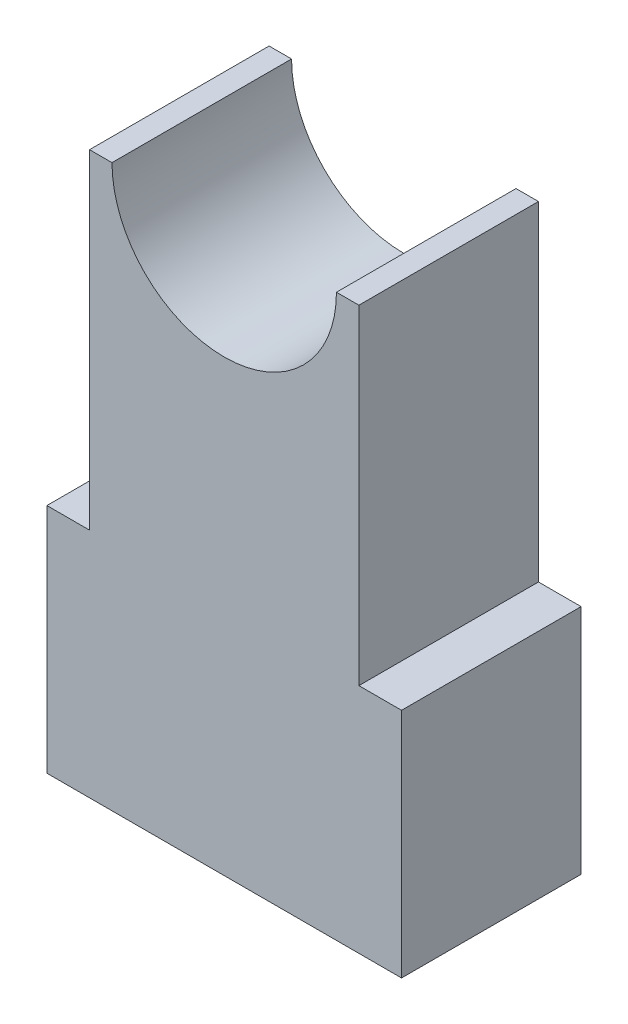
ISO-10303-21;
HEADER;
FILE_DESCRIPTION(('STEP AP214'),'2;1');
FILE_NAME('part.step','',(''),(''),'','','');
FILE_SCHEMA(('AUTOMOTIVE_DESIGN { 1 0 10303 214 1 1 1 1 }'));
ENDSEC;
DATA;
#1=APPLICATION_CONTEXT('core data for automotive mechanical design processes');
#2=APPLICATION_PROTOCOL_DEFINITION('international standard','automotive_design',2000,#1);
#3=PRODUCT_CONTEXT('',#1,'mechanical');
#4=PRODUCT('Part','Part','',(#3));
#5=PRODUCT_RELATED_PRODUCT_CATEGORY('part','',(#4));
#6=PRODUCT_DEFINITION_FORMATION('','',#4);
#7=PRODUCT_DEFINITION_CONTEXT('part definition',#1,'design');
#8=PRODUCT_DEFINITION('design','',#6,#7);
#9=PRODUCT_DEFINITION_SHAPE('','',#8);
#10=(LENGTH_UNIT() NAMED_UNIT(*) SI_UNIT(.MILLI.,.METRE.));
#11=(NAMED_UNIT(*) PLANE_ANGLE_UNIT() SI_UNIT($,.RADIAN.));
#12=(NAMED_UNIT(*) SI_UNIT($,.STERADIAN.) SOLID_ANGLE_UNIT());
#13=UNCERTAINTY_MEASURE_WITH_UNIT(LENGTH_MEASURE(1.E-05),#10,'distance_accuracy_value','');
#14=(GEOMETRIC_REPRESENTATION_CONTEXT(3) GLOBAL_UNCERTAINTY_ASSIGNED_CONTEXT((#13)) GLOBAL_UNIT_ASSIGNED_CONTEXT((#10,
#11,#12)) REPRESENTATION_CONTEXT('',''));
#15=CARTESIAN_POINT('',(0.,0.,0.));
#16=DIRECTION('',(0.,0.,1.));
#17=DIRECTION('',(1.,0.,0.));
#18=AXIS2_PLACEMENT_3D('',#15,#16,#17);
#19=CARTESIAN_POINT('',(15.8,25.01,0.));
#20=DIRECTION('',(0.,0.,-1.));
#21=DIRECTION('',(-1.,0.,0.));
#22=AXIS2_PLACEMENT_3D('',#19,#20,#21);
#23=PLANE('',#22);
#24=CARTESIAN_POINT('',(7.9,25.01,0.));
#25=DIRECTION('',(0.,0.,-1.));
#26=DIRECTION('',(-1.,0.,0.));
#27=AXIS2_PLACEMENT_3D('',#24,#25,#26);
#28=CIRCLE('',#27,5.);
#29=CARTESIAN_POINT('',(2.9,25.01,0.));
#30=VERTEX_POINT('',#29);
#31=CARTESIAN_POINT('',(12.9,25.01,0.));
#32=VERTEX_POINT('',#31);
#33=EDGE_CURVE('E121',#30,#32,#28,.F.);
#34=ORIENTED_EDGE('',*,*,#33,.F.);
#35=DIRECTION('',(1.,0.,0.));
#36=VECTOR('',#35,1.);
#37=CARTESIAN_POINT('',(15.8,25.01,0.));
#38=LINE('',#37,#36);
#39=CARTESIAN_POINT('',(1.9,25.01,0.));
#40=VERTEX_POINT('',#39);
#41=EDGE_CURVE('E159',#40,#30,#38,.T.);
#42=ORIENTED_EDGE('',*,*,#41,.F.);
#43=DIRECTION('',(0.,1.,0.));
#44=VECTOR('',#43,1.);
#45=CARTESIAN_POINT('',(1.9,10.33,0.));
#46=LINE('',#45,#44);
#47=CARTESIAN_POINT('',(1.9,10.33,0.));
#48=VERTEX_POINT('',#47);
#49=EDGE_CURVE('E167',#48,#40,#46,.T.);
#50=ORIENTED_EDGE('',*,*,#49,.F.);
#51=DIRECTION('',(1.,0.,0.));
#52=VECTOR('',#51,1.);
#53=CARTESIAN_POINT('',(1.9,10.33,0.));
#54=LINE('',#53,#52);
#55=CARTESIAN_POINT('',(0.,10.33,0.));
#56=VERTEX_POINT('',#55);
#57=EDGE_CURVE('E180',#56,#48,#54,.T.);
#58=ORIENTED_EDGE('',*,*,#57,.F.);
#59=DIRECTION('',(0.,-1.,0.));
#60=VECTOR('',#59,1.);
#61=CARTESIAN_POINT('',(0.,25.01,0.));
#62=LINE('',#61,#60);
#63=CARTESIAN_POINT('',(0.,0.,0.));
#64=VERTEX_POINT('',#63);
#65=EDGE_CURVE('E113',#56,#64,#62,.T.);
#66=ORIENTED_EDGE('',*,*,#65,.T.);
#67=DIRECTION('',(1.,0.,0.));
#68=VECTOR('',#67,1.);
#69=CARTESIAN_POINT('',(15.8,0.,0.));
#70=LINE('',#69,#68);
#71=CARTESIAN_POINT('',(15.8,0.,0.));
#72=VERTEX_POINT('',#71);
#73=EDGE_CURVE('E155',#64,#72,#70,.T.);
#74=ORIENTED_EDGE('',*,*,#73,.T.);
#75=DIRECTION('',(0.,-1.,0.));
#76=VECTOR('',#75,1.);
#77=CARTESIAN_POINT('',(15.8,25.01,0.));
#78=LINE('',#77,#76);
#79=CARTESIAN_POINT('',(15.8,10.33,0.));
#80=VERTEX_POINT('',#79);
#81=EDGE_CURVE('E138',#80,#72,#78,.T.);
#82=ORIENTED_EDGE('',*,*,#81,.F.);
#83=DIRECTION('',(1.,0.,0.));
#84=VECTOR('',#83,1.);
#85=CARTESIAN_POINT('',(13.9,10.33,0.));
#86=LINE('',#85,#84);
#87=CARTESIAN_POINT('',(13.9,10.33,0.));
#88=VERTEX_POINT('',#87);
#89=EDGE_CURVE('E190',#88,#80,#86,.T.);
#90=ORIENTED_EDGE('',*,*,#89,.F.);
#91=DIRECTION('',(0.,1.,0.));
#92=VECTOR('',#91,1.);
#93=CARTESIAN_POINT('',(13.9,10.33,0.));
#94=LINE('',#93,#92);
#95=CARTESIAN_POINT('',(13.9,25.01,0.));
#96=VERTEX_POINT('',#95);
#97=EDGE_CURVE('E175',#88,#96,#94,.T.);
#98=ORIENTED_EDGE('',*,*,#97,.T.);
#99=EDGE_CURVE('E148',#32,#96,#38,.T.);
#100=ORIENTED_EDGE('',*,*,#99,.F.);
#101=EDGE_LOOP('',(#34,#42,#50,#58,#66,#74,#82,#90,#98,#100));
#102=FACE_BOUND('',#101,.T.);
#103=ADVANCED_FACE('F32',(#102),#23,.F.);
#104=CARTESIAN_POINT('',(0.,25.01,-8.));
#105=DIRECTION('',(0.,0.,1.));
#106=DIRECTION('',(1.,0.,0.));
#107=AXIS2_PLACEMENT_3D('',#104,#105,#106);
#108=PLANE('',#107);
#109=CARTESIAN_POINT('',(7.9,25.01,-8.));
#110=DIRECTION('',(0.,0.,1.));
#111=DIRECTION('',(1.,0.,0.));
#112=AXIS2_PLACEMENT_3D('',#109,#110,#111);
#113=CIRCLE('',#112,5.);
#114=CARTESIAN_POINT('',(12.9,25.01,-8.));
#115=VERTEX_POINT('',#114);
#116=CARTESIAN_POINT('',(2.9,25.01,-8.));
#117=VERTEX_POINT('',#116);
#118=EDGE_CURVE('E117',#115,#117,#113,.F.);
#119=ORIENTED_EDGE('',*,*,#118,.F.);
#120=DIRECTION('',(-1.,0.,0.));
#121=VECTOR('',#120,1.);
#122=CARTESIAN_POINT('',(0.,25.01,-8.));
#123=LINE('',#122,#121);
#124=CARTESIAN_POINT('',(13.9,25.01,-8.));
#125=VERTEX_POINT('',#124);
#126=EDGE_CURVE('E106',#125,#115,#123,.T.);
#127=ORIENTED_EDGE('',*,*,#126,.F.);
#128=DIRECTION('',(0.,1.,0.));
#129=VECTOR('',#128,1.);
#130=CARTESIAN_POINT('',(13.9,10.33,-8.));
#131=LINE('',#130,#129);
#132=CARTESIAN_POINT('',(13.9,10.33,-8.));
#133=VERTEX_POINT('',#132);
#134=EDGE_CURVE('E184',#133,#125,#131,.T.);
#135=ORIENTED_EDGE('',*,*,#134,.F.);
#136=DIRECTION('',(-1.,0.,0.));
#137=VECTOR('',#136,1.);
#138=CARTESIAN_POINT('',(15.8,10.33,-8.));
#139=LINE('',#138,#137);
#140=CARTESIAN_POINT('',(15.8,10.33,-8.));
#141=VERTEX_POINT('',#140);
#142=EDGE_CURVE('E193',#141,#133,#139,.T.);
#143=ORIENTED_EDGE('',*,*,#142,.F.);
#144=DIRECTION('',(0.,-1.,0.));
#145=VECTOR('',#144,1.);
#146=CARTESIAN_POINT('',(15.8,25.01,-8.));
#147=LINE('',#146,#145);
#148=CARTESIAN_POINT('',(15.8,0.,-8.));
#149=VERTEX_POINT('',#148);
#150=EDGE_CURVE('E140',#141,#149,#147,.T.);
#151=ORIENTED_EDGE('',*,*,#150,.T.);
#152=DIRECTION('',(-1.,0.,0.));
#153=VECTOR('',#152,1.);
#154=CARTESIAN_POINT('',(0.,0.,-8.));
#155=LINE('',#154,#153);
#156=CARTESIAN_POINT('',(0.,0.,-8.));
#157=VERTEX_POINT('',#156);
#158=EDGE_CURVE('E149',#149,#157,#155,.T.);
#159=ORIENTED_EDGE('',*,*,#158,.T.);
#160=DIRECTION('',(0.,-1.,0.));
#161=VECTOR('',#160,1.);
#162=CARTESIAN_POINT('',(0.,25.01,-8.));
#163=LINE('',#162,#161);
#164=CARTESIAN_POINT('',(0.,10.33,-8.));
#165=VERTEX_POINT('',#164);
#166=EDGE_CURVE('E142',#165,#157,#163,.T.);
#167=ORIENTED_EDGE('',*,*,#166,.F.);
#168=DIRECTION('',(-1.,0.,0.));
#169=VECTOR('',#168,1.);
#170=CARTESIAN_POINT('',(0.,10.33,-8.));
#171=LINE('',#170,#169);
#172=CARTESIAN_POINT('',(1.9,10.33,-8.));
#173=VERTEX_POINT('',#172);
#174=EDGE_CURVE('E169',#173,#165,#171,.T.);
#175=ORIENTED_EDGE('',*,*,#174,.F.);
#176=DIRECTION('',(0.,1.,0.));
#177=VECTOR('',#176,1.);
#178=CARTESIAN_POINT('',(1.9,10.33,-8.));
#179=LINE('',#178,#177);
#180=CARTESIAN_POINT('',(1.9,25.01,-8.));
#181=VERTEX_POINT('',#180);
#182=EDGE_CURVE('E166',#173,#181,#179,.T.);
#183=ORIENTED_EDGE('',*,*,#182,.T.);
#184=EDGE_CURVE('E114',#117,#181,#123,.T.);
#185=ORIENTED_EDGE('',*,*,#184,.F.);
#186=EDGE_LOOP('',(#119,#127,#135,#143,#151,#159,#167,#175,#183,#185));
#187=FACE_BOUND('',#186,.T.);
#188=ADVANCED_FACE('F118',(#187),#108,.F.);
#189=CARTESIAN_POINT('',(0.,25.01,0.));
#190=DIRECTION('',(0.,-1.,0.));
#191=DIRECTION('',(0.,0.,-1.));
#192=AXIS2_PLACEMENT_3D('',#189,#190,#191);
#193=PLANE('',#192);
#194=DIRECTION('',(0.,0.,-1.));
#195=VECTOR('',#194,1.);
#196=CARTESIAN_POINT('',(2.9,25.01,38.3067410027269));
#197=LINE('',#196,#195);
#198=EDGE_CURVE('E11',#117,#30,#197,.F.);
#199=ORIENTED_EDGE('',*,*,#198,.F.);
#200=ORIENTED_EDGE('',*,*,#184,.T.);
#201=DIRECTION('',(0.,0.,-1.));
#202=VECTOR('',#201,1.);
#203=CARTESIAN_POINT('',(1.9,25.01,-8.));
#204=LINE('',#203,#202);
#205=EDGE_CURVE('E171',#40,#181,#204,.T.);
#206=ORIENTED_EDGE('',*,*,#205,.F.);
#207=ORIENTED_EDGE('',*,*,#41,.T.);
#208=EDGE_LOOP('',(#199,#200,#206,#207));
#209=FACE_BOUND('',#208,.T.);
#210=ADVANCED_FACE('F224',(#209),#193,.F.);
#211=DIRECTION('',(0.,0.,-1.));
#212=VECTOR('',#211,1.);
#213=CARTESIAN_POINT('',(12.9,25.01,38.3067410027269));
#214=LINE('',#213,#212);
#215=EDGE_CURVE('E40',#32,#115,#214,.T.);
#216=ORIENTED_EDGE('',*,*,#215,.F.);
#217=ORIENTED_EDGE('',*,*,#99,.T.);
#218=DIRECTION('',(0.,0.,1.));
#219=VECTOR('',#218,1.);
#220=CARTESIAN_POINT('',(13.9,25.01,-8.));
#221=LINE('',#220,#219);
#222=EDGE_CURVE('E110',#125,#96,#221,.T.);
#223=ORIENTED_EDGE('',*,*,#222,.F.);
#224=ORIENTED_EDGE('',*,*,#126,.T.);
#225=EDGE_LOOP('',(#216,#217,#223,#224));
#226=FACE_BOUND('',#225,.T.);
#227=ADVANCED_FACE('F108',(#226),#193,.F.);
#228=CARTESIAN_POINT('',(15.8,25.01,-8.));
#229=DIRECTION('',(-1.,0.,0.));
#230=DIRECTION('',(0.,0.,1.));
#231=AXIS2_PLACEMENT_3D('',#228,#229,#230);
#232=PLANE('',#231);
#233=DIRECTION('',(0.,0.,-1.));
#234=VECTOR('',#233,1.);
#235=CARTESIAN_POINT('',(15.8,10.33,0.));
#236=LINE('',#235,#234);
#237=EDGE_CURVE('E195',#80,#141,#236,.T.);
#238=ORIENTED_EDGE('',*,*,#237,.F.);
#239=ORIENTED_EDGE('',*,*,#81,.T.);
#240=DIRECTION('',(0.,0.,-1.));
#241=VECTOR('',#240,1.);
#242=CARTESIAN_POINT('',(15.8,0.,-8.));
#243=LINE('',#242,#241);
#244=EDGE_CURVE('E152',#72,#149,#243,.T.);
#245=ORIENTED_EDGE('',*,*,#244,.T.);
#246=ORIENTED_EDGE('',*,*,#150,.F.);
#247=EDGE_LOOP('',(#238,#239,#245,#246));
#248=FACE_BOUND('',#247,.T.);
#249=ADVANCED_FACE('F208',(#248),#232,.F.);
#250=CARTESIAN_POINT('',(0.,25.01,0.));
#251=DIRECTION('',(1.,0.,0.));
#252=DIRECTION('',(0.,0.,-1.));
#253=AXIS2_PLACEMENT_3D('',#250,#251,#252);
#254=PLANE('',#253);
#255=ORIENTED_EDGE('',*,*,#65,.F.);
#256=DIRECTION('',(0.,0.,1.));
#257=VECTOR('',#256,1.);
#258=CARTESIAN_POINT('',(0.,10.33,0.));
#259=LINE('',#258,#257);
#260=EDGE_CURVE('E174',#165,#56,#259,.T.);
#261=ORIENTED_EDGE('',*,*,#260,.F.);
#262=ORIENTED_EDGE('',*,*,#166,.T.);
#263=DIRECTION('',(0.,0.,1.));
#264=VECTOR('',#263,1.);
#265=CARTESIAN_POINT('',(0.,0.,0.));
#266=LINE('',#265,#264);
#267=EDGE_CURVE('E145',#157,#64,#266,.T.);
#268=ORIENTED_EDGE('',*,*,#267,.T.);
#269=EDGE_LOOP('',(#255,#261,#262,#268));
#270=FACE_BOUND('',#269,.T.);
#271=ADVANCED_FACE('F231',(#270),#254,.F.);
#272=CARTESIAN_POINT('',(0.,0.,0.));
#273=DIRECTION('',(0.,-1.,0.));
#274=DIRECTION('',(0.,0.,-1.));
#275=AXIS2_PLACEMENT_3D('',#272,#273,#274);
#276=PLANE('',#275);
#277=CARTESIAN_POINT('',(11.85,0.,-4.));
#278=DIRECTION('',(0.,-1.,0.));
#279=DIRECTION('',(0.,0.,-1.));
#280=AXIS2_PLACEMENT_3D('',#277,#278,#279);
#281=CIRCLE('',#280,2.4);
#282=CARTESIAN_POINT('',(11.85,0.,-6.4));
#283=VERTEX_POINT('',#282);
#284=EDGE_CURVE('E163',#283,#283,#281,.T.);
#285=ORIENTED_EDGE('',*,*,#284,.F.);
#286=EDGE_LOOP('',(#285));
#287=FACE_BOUND('',#286,.T.);
#288=CARTESIAN_POINT('',(3.95,0.,-4.));
#289=DIRECTION('',(0.,-1.,0.));
#290=DIRECTION('',(0.,0.,-1.));
#291=AXIS2_PLACEMENT_3D('',#288,#289,#290);
#292=CIRCLE('',#291,2.4);
#293=CARTESIAN_POINT('',(3.95,0.,-6.4));
#294=VERTEX_POINT('',#293);
#295=EDGE_CURVE('E157',#294,#294,#292,.T.);
#296=ORIENTED_EDGE('',*,*,#295,.F.);
#297=EDGE_LOOP('',(#296));
#298=FACE_BOUND('',#297,.T.);
#299=ORIENTED_EDGE('',*,*,#73,.F.);
#300=ORIENTED_EDGE('',*,*,#267,.F.);
#301=ORIENTED_EDGE('',*,*,#158,.F.);
#302=ORIENTED_EDGE('',*,*,#244,.F.);
#303=EDGE_LOOP('',(#299,#300,#301,#302));
#304=FACE_BOUND('',#303,.T.);
#305=ADVANCED_FACE('F215',(#287,#298,#304),#276,.T.);
#306=CARTESIAN_POINT('',(3.95,1.7,-4.));
#307=DIRECTION('',(0.,-1.,0.));
#308=DIRECTION('',(0.,0.,-1.));
#309=AXIS2_PLACEMENT_3D('',#306,#307,#308);
#310=CYLINDRICAL_SURFACE('',#309,2.4);
#311=CARTESIAN_POINT('',(3.95,1.5,-4.));
#312=DIRECTION('',(0.,-1.,0.));
#313=DIRECTION('',(0.,0.,-1.));
#314=AXIS2_PLACEMENT_3D('',#311,#312,#313);
#315=CIRCLE('',#314,2.4);
#316=CARTESIAN_POINT('',(3.95,1.5,-6.4));
#317=VERTEX_POINT('',#316);
#318=EDGE_CURVE('E125',#317,#317,#315,.F.);
#319=ORIENTED_EDGE('',*,*,#318,.T.);
#320=EDGE_LOOP('',(#319));
#321=FACE_BOUND('',#320,.T.);
#322=ORIENTED_EDGE('',*,*,#295,.T.);
#323=EDGE_LOOP('',(#322));
#324=FACE_BOUND('',#323,.T.);
#325=ADVANCED_FACE('F238',(#321,#324),#310,.F.);
#326=CARTESIAN_POINT('',(3.95,1.7,-4.));
#327=DIRECTION('',(0.,-1.,0.));
#328=DIRECTION('',(0.,0.,-1.));
#329=AXIS2_PLACEMENT_3D('',#326,#327,#328);
#330=PLANE('',#329);
#331=CARTESIAN_POINT('',(3.95,1.7,-4.));
#332=DIRECTION('',(0.,-1.,0.));
#333=DIRECTION('',(0.,0.,-1.));
#334=AXIS2_PLACEMENT_3D('',#331,#332,#333);
#335=CIRCLE('',#334,2.2);
#336=CARTESIAN_POINT('',(3.95,1.7,-6.2));
#337=VERTEX_POINT('',#336);
#338=EDGE_CURVE('E127',#337,#337,#335,.T.);
#339=ORIENTED_EDGE('',*,*,#338,.T.);
#340=EDGE_LOOP('',(#339));
#341=FACE_BOUND('',#340,.T.);
#342=ADVANCED_FACE('F270',(#341),#330,.T.);
#343=CARTESIAN_POINT('',(11.85,1.7,-4.));
#344=DIRECTION('',(0.,-1.,0.));
#345=DIRECTION('',(0.,0.,-1.));
#346=AXIS2_PLACEMENT_3D('',#343,#344,#345);
#347=CYLINDRICAL_SURFACE('',#346,2.4);
#348=CARTESIAN_POINT('',(11.85,1.5,-4.));
#349=DIRECTION('',(0.,-1.,0.));
#350=DIRECTION('',(0.,0.,-1.));
#351=AXIS2_PLACEMENT_3D('',#348,#349,#350);
#352=CIRCLE('',#351,2.4);
#353=CARTESIAN_POINT('',(11.85,1.5,-6.4));
#354=VERTEX_POINT('',#353);
#355=EDGE_CURVE('E132',#354,#354,#352,.F.);
#356=ORIENTED_EDGE('',*,*,#355,.T.);
#357=EDGE_LOOP('',(#356));
#358=FACE_BOUND('',#357,.T.);
#359=ORIENTED_EDGE('',*,*,#284,.T.);
#360=EDGE_LOOP('',(#359));
#361=FACE_BOUND('',#360,.T.);
#362=ADVANCED_FACE('F263',(#358,#361),#347,.F.);
#363=CARTESIAN_POINT('',(11.85,1.7,-4.));
#364=DIRECTION('',(0.,-1.,0.));
#365=DIRECTION('',(0.,0.,-1.));
#366=AXIS2_PLACEMENT_3D('',#363,#364,#365);
#367=PLANE('',#366);
#368=CARTESIAN_POINT('',(11.85,1.7,-4.));
#369=DIRECTION('',(0.,-1.,0.));
#370=DIRECTION('',(0.,0.,-1.));
#371=AXIS2_PLACEMENT_3D('',#368,#369,#370);
#372=CIRCLE('',#371,2.2);
#373=CARTESIAN_POINT('',(11.85,1.7,-6.2));
#374=VERTEX_POINT('',#373);
#375=EDGE_CURVE('E135',#374,#374,#372,.T.);
#376=ORIENTED_EDGE('',*,*,#375,.T.);
#377=EDGE_LOOP('',(#376));
#378=FACE_BOUND('',#377,.T.);
#379=ADVANCED_FACE('F261',(#378),#367,.T.);
#380=CARTESIAN_POINT('',(1.9,10.33,-8.));
#381=DIRECTION('',(1.,0.,0.));
#382=DIRECTION('',(0.,0.,-1.));
#383=AXIS2_PLACEMENT_3D('',#380,#381,#382);
#384=PLANE('',#383);
#385=ORIENTED_EDGE('',*,*,#205,.T.);
#386=ORIENTED_EDGE('',*,*,#182,.F.);
#387=DIRECTION('',(0.,0.,-1.));
#388=VECTOR('',#387,1.);
#389=CARTESIAN_POINT('',(1.9,10.33,-8.));
#390=LINE('',#389,#388);
#391=EDGE_CURVE('E177',#48,#173,#390,.T.);
#392=ORIENTED_EDGE('',*,*,#391,.F.);
#393=ORIENTED_EDGE('',*,*,#49,.T.);
#394=EDGE_LOOP('',(#385,#386,#392,#393));
#395=FACE_BOUND('',#394,.T.);
#396=ADVANCED_FACE('F226',(#395),#384,.F.);
#397=CARTESIAN_POINT('',(0.,10.33,0.));
#398=DIRECTION('',(0.,-1.,0.));
#399=DIRECTION('',(0.,0.,-1.));
#400=AXIS2_PLACEMENT_3D('',#397,#398,#399);
#401=PLANE('',#400);
#402=ORIENTED_EDGE('',*,*,#260,.T.);
#403=ORIENTED_EDGE('',*,*,#57,.T.);
#404=ORIENTED_EDGE('',*,*,#391,.T.);
#405=ORIENTED_EDGE('',*,*,#174,.T.);
#406=EDGE_LOOP('',(#402,#403,#404,#405));
#407=FACE_BOUND('',#406,.T.);
#408=ADVANCED_FACE('F229',(#407),#401,.F.);
#409=CARTESIAN_POINT('',(13.9,10.33,-8.));
#410=DIRECTION('',(-1.,0.,0.));
#411=DIRECTION('',(0.,0.,1.));
#412=AXIS2_PLACEMENT_3D('',#409,#410,#411);
#413=PLANE('',#412);
#414=ORIENTED_EDGE('',*,*,#222,.T.);
#415=ORIENTED_EDGE('',*,*,#97,.F.);
#416=DIRECTION('',(0.,0.,1.));
#417=VECTOR('',#416,1.);
#418=CARTESIAN_POINT('',(13.9,10.33,-8.));
#419=LINE('',#418,#417);
#420=EDGE_CURVE('E186',#133,#88,#419,.T.);
#421=ORIENTED_EDGE('',*,*,#420,.F.);
#422=ORIENTED_EDGE('',*,*,#134,.T.);
#423=EDGE_LOOP('',(#414,#415,#421,#422));
#424=FACE_BOUND('',#423,.T.);
#425=ADVANCED_FACE('F220',(#424),#413,.F.);
#426=CARTESIAN_POINT('',(0.,10.33,0.));
#427=DIRECTION('',(0.,1.,0.));
#428=DIRECTION('',(0.,0.,1.));
#429=AXIS2_PLACEMENT_3D('',#426,#427,#428);
#430=PLANE('',#429);
#431=ORIENTED_EDGE('',*,*,#89,.T.);
#432=ORIENTED_EDGE('',*,*,#237,.T.);
#433=ORIENTED_EDGE('',*,*,#142,.T.);
#434=ORIENTED_EDGE('',*,*,#420,.T.);
#435=EDGE_LOOP('',(#431,#432,#433,#434));
#436=FACE_BOUND('',#435,.T.);
#437=ADVANCED_FACE('F201',(#436),#430,.T.);
#438=CARTESIAN_POINT('',(11.85,1.5,-4.));
#439=DIRECTION('',(0.,-1.,0.));
#440=DIRECTION('',(0.,0.,-1.));
#441=AXIS2_PLACEMENT_3D('',#438,#439,#440);
#442=TOROIDAL_SURFACE('',#441,2.2,0.2);
#443=ORIENTED_EDGE('',*,*,#355,.F.);
#444=EDGE_LOOP('',(#443));
#445=FACE_BOUND('',#444,.T.);
#446=ORIENTED_EDGE('',*,*,#375,.F.);
#447=EDGE_LOOP('',(#446));
#448=FACE_BOUND('',#447,.T.);
#449=ADVANCED_FACE('F248',(#445,#448),#442,.F.);
#450=CARTESIAN_POINT('',(3.95,1.5,-4.));
#451=DIRECTION('',(0.,-1.,0.));
#452=DIRECTION('',(0.,0.,-1.));
#453=AXIS2_PLACEMENT_3D('',#450,#451,#452);
#454=TOROIDAL_SURFACE('',#453,2.2,0.2);
#455=ORIENTED_EDGE('',*,*,#318,.F.);
#456=EDGE_LOOP('',(#455));
#457=FACE_BOUND('',#456,.T.);
#458=ORIENTED_EDGE('',*,*,#338,.F.);
#459=EDGE_LOOP('',(#458));
#460=FACE_BOUND('',#459,.T.);
#461=ADVANCED_FACE('F34',(#457,#460),#454,.F.);
#462=CARTESIAN_POINT('',(7.9,25.01,38.3067410027269));
#463=DIRECTION('',(0.,0.,-1.));
#464=DIRECTION('',(-1.,0.,0.));
#465=AXIS2_PLACEMENT_3D('',#462,#463,#464);
#466=CYLINDRICAL_SURFACE('',#465,5.);
#467=ORIENTED_EDGE('',*,*,#198,.T.);
#468=ORIENTED_EDGE('',*,*,#33,.T.);
#469=ORIENTED_EDGE('',*,*,#215,.T.);
#470=ORIENTED_EDGE('',*,*,#118,.T.);
#471=EDGE_LOOP('',(#467,#468,#469,#470));
#472=FACE_BOUND('',#471,.T.);
#473=ADVANCED_FACE('F124',(#472),#466,.F.);
#474=CLOSED_SHELL('',(#103,#188,#210,#227,#249,#271,#305,#325,#342,#362,#379,#396,#408,#425,
#437,#449,#461,#473));
#475=MANIFOLD_SOLID_BREP('B2',#474);
#476=ADVANCED_BREP_SHAPE_REPRESENTATION('',(#18,#475),#14);
#477=SHAPE_DEFINITION_REPRESENTATION(#9,#476);
ENDSEC;
END-ISO-10303-21;
